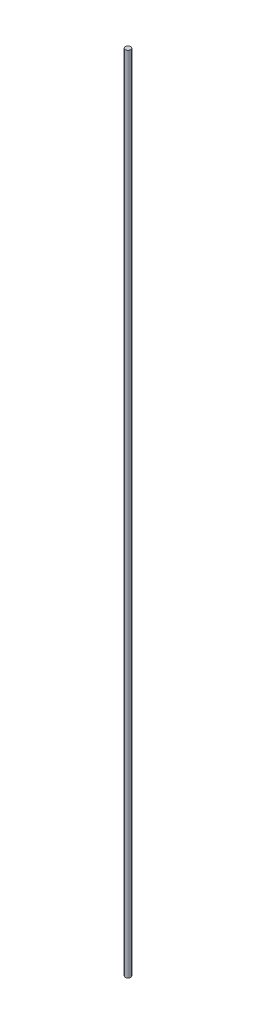
ISO-10303-21;
HEADER;
FILE_DESCRIPTION(('STEP AP214'),'2;1');
FILE_NAME('part.step','',(''),(''),'','','');
FILE_SCHEMA(('AUTOMOTIVE_DESIGN { 1 0 10303 214 1 1 1 1 }'));
ENDSEC;
DATA;
#1=APPLICATION_CONTEXT('core data for automotive mechanical design processes');
#2=APPLICATION_PROTOCOL_DEFINITION('international standard','automotive_design',2000,#1);
#3=PRODUCT_CONTEXT('',#1,'mechanical');
#4=PRODUCT('Part','Part','',(#3));
#5=PRODUCT_RELATED_PRODUCT_CATEGORY('part','',(#4));
#6=PRODUCT_DEFINITION_FORMATION('','',#4);
#7=PRODUCT_DEFINITION_CONTEXT('part definition',#1,'design');
#8=PRODUCT_DEFINITION('design','',#6,#7);
#9=PRODUCT_DEFINITION_SHAPE('','',#8);
#10=(LENGTH_UNIT() NAMED_UNIT(*) SI_UNIT(.MILLI.,.METRE.));
#11=(NAMED_UNIT(*) PLANE_ANGLE_UNIT() SI_UNIT($,.RADIAN.));
#12=(NAMED_UNIT(*) SI_UNIT($,.STERADIAN.) SOLID_ANGLE_UNIT());
#13=UNCERTAINTY_MEASURE_WITH_UNIT(LENGTH_MEASURE(1.E-05),#10,'distance_accuracy_value','');
#14=(GEOMETRIC_REPRESENTATION_CONTEXT(3) GLOBAL_UNCERTAINTY_ASSIGNED_CONTEXT((#13)) GLOBAL_UNIT_ASSIGNED_CONTEXT((#10,
#11,#12)) REPRESENTATION_CONTEXT('',''));
#15=CARTESIAN_POINT('',(0.,0.,0.));
#16=DIRECTION('',(0.,0.,1.));
#17=DIRECTION('',(1.,0.,0.));
#18=AXIS2_PLACEMENT_3D('',#15,#16,#17);
#19=CARTESIAN_POINT('',(0.,300.,0.));
#20=DIRECTION('',(0.,-1.,0.));
#21=DIRECTION('',(0.,0.,-1.));
#22=AXIS2_PLACEMENT_3D('',#19,#20,#21);
#23=CYLINDRICAL_SURFACE('',#22,1.);
#24=CARTESIAN_POINT('',(0.,300.,0.));
#25=DIRECTION('',(0.,1.,0.));
#26=DIRECTION('',(0.,0.,1.));
#27=AXIS2_PLACEMENT_3D('',#24,#25,#26);
#28=CIRCLE('',#27,1.);
#29=CARTESIAN_POINT('',(0.,300.,1.));
#30=VERTEX_POINT('',#29);
#31=EDGE_CURVE('E10',#30,#30,#28,.T.);
#32=ORIENTED_EDGE('',*,*,#31,.F.);
#33=EDGE_LOOP('',(#32));
#34=FACE_BOUND('',#33,.T.);
#35=CARTESIAN_POINT('',(0.,0.,0.));
#36=DIRECTION('',(0.,1.,0.));
#37=DIRECTION('',(0.,0.,1.));
#38=AXIS2_PLACEMENT_3D('',#35,#36,#37);
#39=CIRCLE('',#38,1.);
#40=CARTESIAN_POINT('',(0.,0.,1.));
#41=VERTEX_POINT('',#40);
#42=EDGE_CURVE('E40',#41,#41,#39,.T.);
#43=ORIENTED_EDGE('',*,*,#42,.T.);
#44=EDGE_LOOP('',(#43));
#45=FACE_BOUND('',#44,.T.);
#46=ADVANCED_FACE('F37',(#34,#45),#23,.T.);
#47=CARTESIAN_POINT('',(0.,300.,0.));
#48=DIRECTION('',(0.,1.,0.));
#49=DIRECTION('',(0.,0.,1.));
#50=AXIS2_PLACEMENT_3D('',#47,#48,#49);
#51=PLANE('',#50);
#52=ORIENTED_EDGE('',*,*,#31,.T.);
#53=EDGE_LOOP('',(#52));
#54=FACE_BOUND('',#53,.T.);
#55=ADVANCED_FACE('F54',(#54),#51,.T.);
#56=CARTESIAN_POINT('',(0.,0.,0.));
#57=DIRECTION('',(0.,1.,0.));
#58=DIRECTION('',(0.,0.,1.));
#59=AXIS2_PLACEMENT_3D('',#56,#57,#58);
#60=PLANE('',#59);
#61=ORIENTED_EDGE('',*,*,#42,.F.);
#62=EDGE_LOOP('',(#61));
#63=FACE_BOUND('',#62,.T.);
#64=ADVANCED_FACE('F52',(#63),#60,.F.);
#65=CLOSED_SHELL('',(#46,#55,#64));
#66=MANIFOLD_SOLID_BREP('B2',#65);
#67=ADVANCED_BREP_SHAPE_REPRESENTATION('',(#18,#66),#14);
#68=SHAPE_DEFINITION_REPRESENTATION(#9,#67);
ENDSEC;
END-ISO-10303-21;
